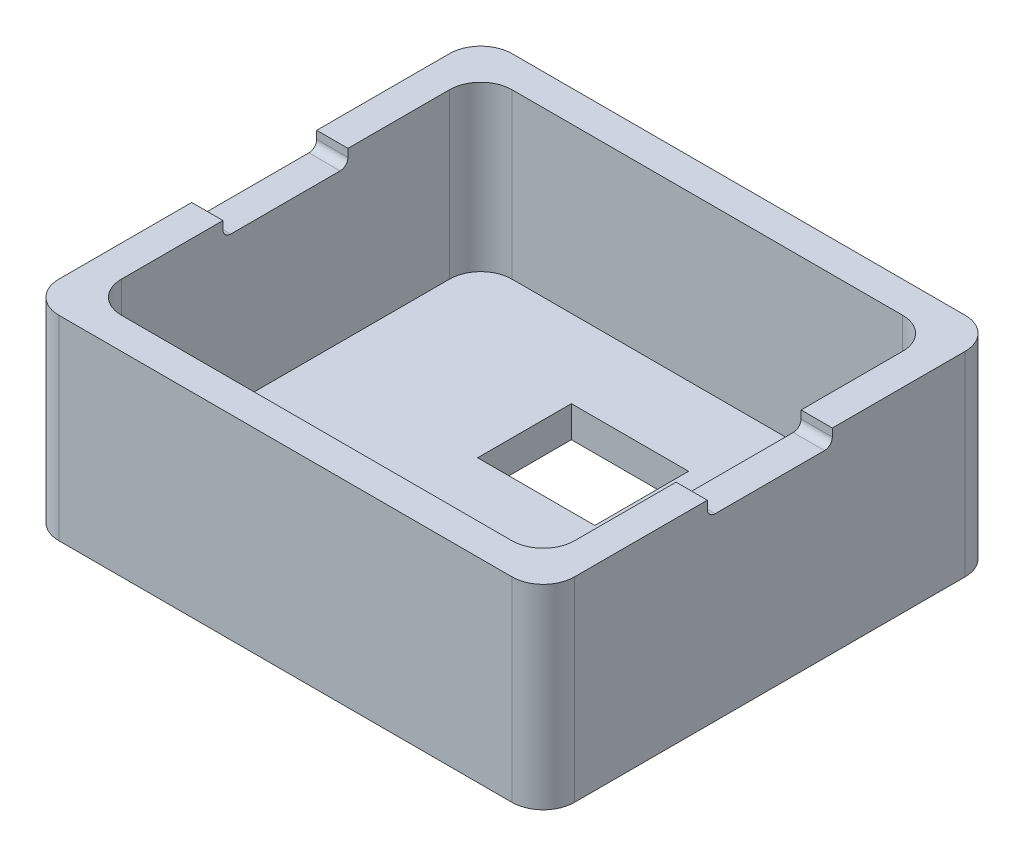
ISO-10303-21;
HEADER;
FILE_DESCRIPTION(('STEP AP214'),'2;1');
FILE_NAME('part.step','',(''),(''),'','','');
FILE_SCHEMA(('AUTOMOTIVE_DESIGN { 1 0 10303 214 1 1 1 1 }'));
ENDSEC;
DATA;
#1=APPLICATION_CONTEXT('core data for automotive mechanical design processes');
#2=APPLICATION_PROTOCOL_DEFINITION('international standard','automotive_design',2000,#1);
#3=PRODUCT_CONTEXT('',#1,'mechanical');
#4=PRODUCT('Part','Part','',(#3));
#5=PRODUCT_RELATED_PRODUCT_CATEGORY('part','',(#4));
#6=PRODUCT_DEFINITION_FORMATION('','',#4);
#7=PRODUCT_DEFINITION_CONTEXT('part definition',#1,'design');
#8=PRODUCT_DEFINITION('design','',#6,#7);
#9=PRODUCT_DEFINITION_SHAPE('','',#8);
#10=(LENGTH_UNIT() NAMED_UNIT(*) SI_UNIT(.MILLI.,.METRE.));
#11=(NAMED_UNIT(*) PLANE_ANGLE_UNIT() SI_UNIT($,.RADIAN.));
#12=(NAMED_UNIT(*) SI_UNIT($,.STERADIAN.) SOLID_ANGLE_UNIT());
#13=UNCERTAINTY_MEASURE_WITH_UNIT(LENGTH_MEASURE(1.E-05),#10,'distance_accuracy_value','');
#14=(GEOMETRIC_REPRESENTATION_CONTEXT(3) GLOBAL_UNCERTAINTY_ASSIGNED_CONTEXT((#13)) GLOBAL_UNIT_ASSIGNED_CONTEXT((#10,
#11,#12)) REPRESENTATION_CONTEXT('',''));
#15=CARTESIAN_POINT('',(0.,0.,0.));
#16=DIRECTION('',(0.,0.,1.));
#17=DIRECTION('',(1.,0.,0.));
#18=AXIS2_PLACEMENT_3D('',#15,#16,#17);
#19=CARTESIAN_POINT('',(-16.5,2.,14.5));
#20=DIRECTION('',(1.,0.,0.));
#21=DIRECTION('',(0.,0.,-1.));
#22=AXIS2_PLACEMENT_3D('',#19,#20,#21);
#23=PLANE('',#22);
#24=DIRECTION('',(0.,-1.,0.));
#25=VECTOR('',#24,1.);
#26=CARTESIAN_POINT('',(-16.5,11.5,4.));
#27=LINE('',#26,#25);
#28=CARTESIAN_POINT('',(-16.5,12.5,4.));
#29=VERTEX_POINT('',#28);
#30=CARTESIAN_POINT('',(-16.5,12.,4.));
#31=VERTEX_POINT('',#30);
#32=EDGE_CURVE('E257',#29,#31,#27,.T.);
#33=ORIENTED_EDGE('',*,*,#32,.T.);
#34=CARTESIAN_POINT('',(-16.5,12.,3.5));
#35=DIRECTION('',(1.,0.,0.));
#36=DIRECTION('',(0.,0.,-1.));
#37=AXIS2_PLACEMENT_3D('',#34,#35,#36);
#38=CIRCLE('',#37,0.5);
#39=CARTESIAN_POINT('',(-16.5,11.5,3.5));
#40=VERTEX_POINT('',#39);
#41=EDGE_CURVE('E57',#31,#40,#38,.T.);
#42=ORIENTED_EDGE('',*,*,#41,.T.);
#43=DIRECTION('',(0.,0.,-1.));
#44=VECTOR('',#43,1.);
#45=CARTESIAN_POINT('',(-16.5,11.5,4.));
#46=LINE('',#45,#44);
#47=CARTESIAN_POINT('',(-16.5,11.5,-3.5));
#48=VERTEX_POINT('',#47);
#49=EDGE_CURVE('E266',#40,#48,#46,.T.);
#50=ORIENTED_EDGE('',*,*,#49,.T.);
#51=CARTESIAN_POINT('',(-16.5,12.,-3.5));
#52=DIRECTION('',(1.,0.,0.));
#53=DIRECTION('',(0.,0.,-1.));
#54=AXIS2_PLACEMENT_3D('',#51,#52,#53);
#55=CIRCLE('',#54,0.5);
#56=CARTESIAN_POINT('',(-16.5,12.,-4.));
#57=VERTEX_POINT('',#56);
#58=EDGE_CURVE('E467',#48,#57,#55,.T.);
#59=ORIENTED_EDGE('',*,*,#58,.T.);
#60=DIRECTION('',(0.,1.,0.));
#61=VECTOR('',#60,1.);
#62=CARTESIAN_POINT('',(-16.5,11.5,-4.));
#63=LINE('',#62,#61);
#64=CARTESIAN_POINT('',(-16.5,12.5,-4.));
#65=VERTEX_POINT('',#64);
#66=EDGE_CURVE('E480',#57,#65,#63,.T.);
#67=ORIENTED_EDGE('',*,*,#66,.T.);
#68=DIRECTION('',(0.,0.,1.));
#69=VECTOR('',#68,1.);
#70=CARTESIAN_POINT('',(-16.5,12.5,14.5));
#71=LINE('',#70,#69);
#72=CARTESIAN_POINT('',(-16.5,12.5,-12.5));
#73=VERTEX_POINT('',#72);
#74=EDGE_CURVE('E282',#73,#65,#71,.T.);
#75=ORIENTED_EDGE('',*,*,#74,.F.);
#76=DIRECTION('',(0.,-1.,0.));
#77=VECTOR('',#76,1.);
#78=CARTESIAN_POINT('',(-16.5,2.,-12.5));
#79=LINE('',#78,#77);
#80=CARTESIAN_POINT('',(-16.5,0.,-12.5));
#81=VERTEX_POINT('',#80);
#82=EDGE_CURVE('E357',#73,#81,#79,.T.);
#83=ORIENTED_EDGE('',*,*,#82,.T.);
#84=DIRECTION('',(0.,0.,1.));
#85=VECTOR('',#84,1.);
#86=CARTESIAN_POINT('',(-16.5,0.,14.5));
#87=LINE('',#86,#85);
#88=CARTESIAN_POINT('',(-16.5,0.,12.5));
#89=VERTEX_POINT('',#88);
#90=EDGE_CURVE('E308',#81,#89,#87,.T.);
#91=ORIENTED_EDGE('',*,*,#90,.T.);
#92=DIRECTION('',(0.,-1.,0.));
#93=VECTOR('',#92,1.);
#94=CARTESIAN_POINT('',(-16.5,2.,12.5));
#95=LINE('',#94,#93);
#96=CARTESIAN_POINT('',(-16.5,12.5,12.5));
#97=VERTEX_POINT('',#96);
#98=EDGE_CURVE('E279',#89,#97,#95,.F.);
#99=ORIENTED_EDGE('',*,*,#98,.T.);
#100=EDGE_CURVE('E270',#29,#97,#71,.T.);
#101=ORIENTED_EDGE('',*,*,#100,.F.);
#102=EDGE_LOOP('',(#33,#42,#50,#59,#67,#75,#83,#91,#99,#101));
#103=FACE_BOUND('',#102,.T.);
#104=ADVANCED_FACE('F48',(#103),#23,.F.);
#105=CARTESIAN_POINT('',(0.,12.5,0.));
#106=DIRECTION('',(0.,-1.,0.));
#107=DIRECTION('',(0.,0.,-1.));
#108=AXIS2_PLACEMENT_3D('',#105,#106,#107);
#109=PLANE('',#108);
#110=DIRECTION('',(-1.,0.,0.));
#111=VECTOR('',#110,1.);
#112=CARTESIAN_POINT('',(22.5622577482985,12.5,4.));
#113=LINE('',#112,#111);
#114=CARTESIAN_POINT('',(-14.5,12.5,4.));
#115=VERTEX_POINT('',#114);
#116=EDGE_CURVE('E260',#115,#29,#113,.T.);
#117=ORIENTED_EDGE('',*,*,#116,.T.);
#118=ORIENTED_EDGE('',*,*,#100,.T.);
#119=CARTESIAN_POINT('',(-14.5,12.5,12.5));
#120=DIRECTION('',(0.,-1.,0.));
#121=DIRECTION('',(0.,0.,-1.));
#122=AXIS2_PLACEMENT_3D('',#119,#120,#121);
#123=CIRCLE('',#122,2.);
#124=CARTESIAN_POINT('',(-14.5,12.5,14.5));
#125=VERTEX_POINT('',#124);
#126=EDGE_CURVE('E380',#97,#125,#123,.F.);
#127=ORIENTED_EDGE('',*,*,#126,.T.);
#128=DIRECTION('',(1.,0.,0.));
#129=VECTOR('',#128,1.);
#130=CARTESIAN_POINT('',(-16.5,12.5,14.5));
#131=LINE('',#130,#129);
#132=CARTESIAN_POINT('',(14.5,12.5,14.5));
#133=VERTEX_POINT('',#132);
#134=EDGE_CURVE('E290',#125,#133,#131,.T.);
#135=ORIENTED_EDGE('',*,*,#134,.T.);
#136=CARTESIAN_POINT('',(14.5,12.5,12.5));
#137=DIRECTION('',(0.,-1.,0.));
#138=DIRECTION('',(0.,0.,-1.));
#139=AXIS2_PLACEMENT_3D('',#136,#137,#138);
#140=CIRCLE('',#139,2.);
#141=CARTESIAN_POINT('',(16.5,12.5,12.5));
#142=VERTEX_POINT('',#141);
#143=EDGE_CURVE('E383',#133,#142,#140,.F.);
#144=ORIENTED_EDGE('',*,*,#143,.T.);
#145=DIRECTION('',(0.,0.,-1.));
#146=VECTOR('',#145,1.);
#147=CARTESIAN_POINT('',(16.5,12.5,14.5));
#148=LINE('',#147,#146);
#149=CARTESIAN_POINT('',(16.5,12.5,4.));
#150=VERTEX_POINT('',#149);
#151=EDGE_CURVE('E293',#142,#150,#148,.T.);
#152=ORIENTED_EDGE('',*,*,#151,.T.);
#153=DIRECTION('',(1.,0.,0.));
#154=VECTOR('',#153,1.);
#155=CARTESIAN_POINT('',(6.43774225170145,12.5,4.));
#156=LINE('',#155,#154);
#157=CARTESIAN_POINT('',(14.5,12.5,4.));
#158=VERTEX_POINT('',#157);
#159=EDGE_CURVE('E577',#158,#150,#156,.T.);
#160=ORIENTED_EDGE('',*,*,#159,.F.);
#161=DIRECTION('',(0.,0.,-1.));
#162=VECTOR('',#161,1.);
#163=CARTESIAN_POINT('',(14.5,12.5,12.5));
#164=LINE('',#163,#162);
#165=CARTESIAN_POINT('',(14.5,12.5,10.5));
#166=VERTEX_POINT('',#165);
#167=EDGE_CURVE('E632',#166,#158,#164,.T.);
#168=ORIENTED_EDGE('',*,*,#167,.F.);
#169=CARTESIAN_POINT('',(12.5,12.5,10.5));
#170=DIRECTION('',(0.,-1.,0.));
#171=DIRECTION('',(0.,0.,-1.));
#172=AXIS2_PLACEMENT_3D('',#169,#170,#171);
#173=CIRCLE('',#172,2.);
#174=CARTESIAN_POINT('',(12.5,12.5,12.5));
#175=VERTEX_POINT('',#174);
#176=EDGE_CURVE('E413',#166,#175,#173,.T.);
#177=ORIENTED_EDGE('',*,*,#176,.T.);
#178=DIRECTION('',(1.,0.,0.));
#179=VECTOR('',#178,1.);
#180=CARTESIAN_POINT('',(-14.5,12.5,12.5));
#181=LINE('',#180,#179);
#182=CARTESIAN_POINT('',(-12.5,12.5,12.5));
#183=VERTEX_POINT('',#182);
#184=EDGE_CURVE('E644',#183,#175,#181,.T.);
#185=ORIENTED_EDGE('',*,*,#184,.F.);
#186=CARTESIAN_POINT('',(-12.5,12.5,10.5));
#187=DIRECTION('',(0.,-1.,0.));
#188=DIRECTION('',(0.,0.,-1.));
#189=AXIS2_PLACEMENT_3D('',#186,#187,#188);
#190=CIRCLE('',#189,2.);
#191=CARTESIAN_POINT('',(-14.5,12.5,10.5));
#192=VERTEX_POINT('',#191);
#193=EDGE_CURVE('E416',#183,#192,#190,.T.);
#194=ORIENTED_EDGE('',*,*,#193,.T.);
#195=DIRECTION('',(0.,0.,1.));
#196=VECTOR('',#195,1.);
#197=CARTESIAN_POINT('',(-14.5,12.5,12.5));
#198=LINE('',#197,#196);
#199=EDGE_CURVE('E273',#115,#192,#198,.T.);
#200=ORIENTED_EDGE('',*,*,#199,.F.);
#201=EDGE_LOOP('',(#117,#118,#127,#135,#144,#152,#160,#168,#177,#185,#194,#200));
#202=FACE_BOUND('',#201,.T.);
#203=ADVANCED_FACE('F269',(#202),#109,.F.);
#204=DIRECTION('',(-1.,0.,0.));
#205=VECTOR('',#204,1.);
#206=CARTESIAN_POINT('',(22.5622577482985,12.5,-4.));
#207=LINE('',#206,#205);
#208=CARTESIAN_POINT('',(-14.5,12.5,-4.));
#209=VERTEX_POINT('',#208);
#210=EDGE_CURVE('E275',#209,#65,#207,.T.);
#211=ORIENTED_EDGE('',*,*,#210,.F.);
#212=CARTESIAN_POINT('',(-14.5,12.5,-10.5));
#213=VERTEX_POINT('',#212);
#214=EDGE_CURVE('E640',#213,#209,#198,.T.);
#215=ORIENTED_EDGE('',*,*,#214,.F.);
#216=CARTESIAN_POINT('',(-12.5,12.5,-10.5));
#217=DIRECTION('',(0.,-1.,0.));
#218=DIRECTION('',(0.,0.,-1.));
#219=AXIS2_PLACEMENT_3D('',#216,#217,#218);
#220=CIRCLE('',#219,2.);
#221=CARTESIAN_POINT('',(-12.5,12.5,-12.5));
#222=VERTEX_POINT('',#221);
#223=EDGE_CURVE('E406',#213,#222,#220,.T.);
#224=ORIENTED_EDGE('',*,*,#223,.T.);
#225=DIRECTION('',(-1.,0.,0.));
#226=VECTOR('',#225,1.);
#227=CARTESIAN_POINT('',(-14.5,12.5,-12.5));
#228=LINE('',#227,#226);
#229=CARTESIAN_POINT('',(12.5,12.5,-12.5));
#230=VERTEX_POINT('',#229);
#231=EDGE_CURVE('E635',#230,#222,#228,.T.);
#232=ORIENTED_EDGE('',*,*,#231,.F.);
#233=CARTESIAN_POINT('',(12.5,12.5,-10.5));
#234=DIRECTION('',(0.,-1.,0.));
#235=DIRECTION('',(0.,0.,-1.));
#236=AXIS2_PLACEMENT_3D('',#233,#234,#235);
#237=CIRCLE('',#236,2.);
#238=CARTESIAN_POINT('',(14.5,12.5,-10.5));
#239=VERTEX_POINT('',#238);
#240=EDGE_CURVE('E409',#230,#239,#237,.T.);
#241=ORIENTED_EDGE('',*,*,#240,.T.);
#242=CARTESIAN_POINT('',(14.5,12.5,-4.));
#243=VERTEX_POINT('',#242);
#244=EDGE_CURVE('E636',#243,#239,#164,.T.);
#245=ORIENTED_EDGE('',*,*,#244,.F.);
#246=DIRECTION('',(1.,0.,0.));
#247=VECTOR('',#246,1.);
#248=CARTESIAN_POINT('',(6.43774225170145,12.5,-4.));
#249=LINE('',#248,#247);
#250=CARTESIAN_POINT('',(16.5,12.5,-4.));
#251=VERTEX_POINT('',#250);
#252=EDGE_CURVE('E574',#243,#251,#249,.T.);
#253=ORIENTED_EDGE('',*,*,#252,.T.);
#254=CARTESIAN_POINT('',(16.5,12.5,-12.5));
#255=VERTEX_POINT('',#254);
#256=EDGE_CURVE('E648',#251,#255,#148,.T.);
#257=ORIENTED_EDGE('',*,*,#256,.T.);
#258=CARTESIAN_POINT('',(14.5,12.5,-12.5));
#259=DIRECTION('',(0.,-1.,0.));
#260=DIRECTION('',(0.,0.,-1.));
#261=AXIS2_PLACEMENT_3D('',#258,#259,#260);
#262=CIRCLE('',#261,2.);
#263=CARTESIAN_POINT('',(14.5,12.5,-14.5));
#264=VERTEX_POINT('',#263);
#265=EDGE_CURVE('E386',#255,#264,#262,.F.);
#266=ORIENTED_EDGE('',*,*,#265,.T.);
#267=DIRECTION('',(-1.,0.,0.));
#268=VECTOR('',#267,1.);
#269=CARTESIAN_POINT('',(-16.5,12.5,-14.5));
#270=LINE('',#269,#268);
#271=CARTESIAN_POINT('',(-14.5,12.5,-14.5));
#272=VERTEX_POINT('',#271);
#273=EDGE_CURVE('E283',#264,#272,#270,.T.);
#274=ORIENTED_EDGE('',*,*,#273,.T.);
#275=CARTESIAN_POINT('',(-14.5,12.5,-12.5));
#276=DIRECTION('',(0.,-1.,0.));
#277=DIRECTION('',(0.,0.,-1.));
#278=AXIS2_PLACEMENT_3D('',#275,#276,#277);
#279=CIRCLE('',#278,2.);
#280=EDGE_CURVE('E389',#272,#73,#279,.F.);
#281=ORIENTED_EDGE('',*,*,#280,.T.);
#282=ORIENTED_EDGE('',*,*,#74,.T.);
#283=EDGE_LOOP('',(#211,#215,#224,#232,#241,#245,#253,#257,#266,#274,#281,#282));
#284=FACE_BOUND('',#283,.T.);
#285=ADVANCED_FACE('F492',(#284),#109,.F.);
#286=CARTESIAN_POINT('',(-14.5,12.5,12.5));
#287=DIRECTION('',(1.,0.,0.));
#288=DIRECTION('',(0.,0.,-1.));
#289=AXIS2_PLACEMENT_3D('',#286,#287,#288);
#290=PLANE('',#289);
#291=DIRECTION('',(0.,-1.,0.));
#292=VECTOR('',#291,1.);
#293=CARTESIAN_POINT('',(-14.5,12.5,-4.));
#294=LINE('',#293,#292);
#295=CARTESIAN_POINT('',(-14.5,12.,-4.));
#296=VERTEX_POINT('',#295);
#297=EDGE_CURVE('E445',#209,#296,#294,.T.);
#298=ORIENTED_EDGE('',*,*,#297,.T.);
#299=CARTESIAN_POINT('',(-14.5,12.,-3.5));
#300=DIRECTION('',(1.,0.,0.));
#301=DIRECTION('',(0.,0.,-1.));
#302=AXIS2_PLACEMENT_3D('',#299,#300,#301);
#303=CIRCLE('',#302,0.5);
#304=CARTESIAN_POINT('',(-14.5,11.5,-3.5));
#305=VERTEX_POINT('',#304);
#306=EDGE_CURVE('E470',#296,#305,#303,.F.);
#307=ORIENTED_EDGE('',*,*,#306,.T.);
#308=DIRECTION('',(0.,0.,1.));
#309=VECTOR('',#308,1.);
#310=CARTESIAN_POINT('',(-14.5,11.5,12.5));
#311=LINE('',#310,#309);
#312=CARTESIAN_POINT('',(-14.5,11.5,3.5));
#313=VERTEX_POINT('',#312);
#314=EDGE_CURVE('E449',#305,#313,#311,.T.);
#315=ORIENTED_EDGE('',*,*,#314,.T.);
#316=CARTESIAN_POINT('',(-14.5,12.,3.5));
#317=DIRECTION('',(1.,0.,0.));
#318=DIRECTION('',(0.,0.,-1.));
#319=AXIS2_PLACEMENT_3D('',#316,#317,#318);
#320=CIRCLE('',#319,0.5);
#321=CARTESIAN_POINT('',(-14.5,12.,4.));
#322=VERTEX_POINT('',#321);
#323=EDGE_CURVE('E11',#313,#322,#320,.F.);
#324=ORIENTED_EDGE('',*,*,#323,.T.);
#325=DIRECTION('',(0.,1.,0.));
#326=VECTOR('',#325,1.);
#327=CARTESIAN_POINT('',(-14.5,12.5,4.));
#328=LINE('',#327,#326);
#329=EDGE_CURVE('E452',#322,#115,#328,.T.);
#330=ORIENTED_EDGE('',*,*,#329,.T.);
#331=ORIENTED_EDGE('',*,*,#199,.T.);
#332=DIRECTION('',(0.,-1.,0.));
#333=VECTOR('',#332,1.);
#334=CARTESIAN_POINT('',(-14.5,2.,10.5));
#335=LINE('',#334,#333);
#336=CARTESIAN_POINT('',(-14.5,2.,10.5));
#337=VERTEX_POINT('',#336);
#338=EDGE_CURVE('E334',#192,#337,#335,.T.);
#339=ORIENTED_EDGE('',*,*,#338,.T.);
#340=DIRECTION('',(0.,0.,1.));
#341=VECTOR('',#340,1.);
#342=CARTESIAN_POINT('',(-14.5,2.,12.5));
#343=LINE('',#342,#341);
#344=CARTESIAN_POINT('',(-14.5,2.,-10.5));
#345=VERTEX_POINT('',#344);
#346=EDGE_CURVE('E656',#345,#337,#343,.T.);
#347=ORIENTED_EDGE('',*,*,#346,.F.);
#348=DIRECTION('',(0.,-1.,0.));
#349=VECTOR('',#348,1.);
#350=CARTESIAN_POINT('',(-14.5,12.5,-10.5));
#351=LINE('',#350,#349);
#352=EDGE_CURVE('E338',#345,#213,#351,.F.);
#353=ORIENTED_EDGE('',*,*,#352,.T.);
#354=ORIENTED_EDGE('',*,*,#214,.T.);
#355=EDGE_LOOP('',(#298,#307,#315,#324,#330,#331,#339,#347,#353,#354));
#356=FACE_BOUND('',#355,.T.);
#357=ADVANCED_FACE('F698',(#356),#290,.T.);
#358=CARTESIAN_POINT('',(0.,2.,0.));
#359=DIRECTION('',(0.,-1.,0.));
#360=DIRECTION('',(0.,0.,-1.));
#361=AXIS2_PLACEMENT_3D('',#358,#359,#360);
#362=PLANE('',#361);
#363=DIRECTION('',(-1.,0.,0.));
#364=VECTOR('',#363,1.);
#365=CARTESIAN_POINT('',(-14.5,2.,-12.5));
#366=LINE('',#365,#364);
#367=CARTESIAN_POINT('',(12.5,2.,-12.5));
#368=VERTEX_POINT('',#367);
#369=CARTESIAN_POINT('',(-12.5,2.,-12.5));
#370=VERTEX_POINT('',#369);
#371=EDGE_CURVE('E652',#368,#370,#366,.T.);
#372=ORIENTED_EDGE('',*,*,#371,.T.);
#373=CARTESIAN_POINT('',(-12.5,2.,-10.5));
#374=DIRECTION('',(0.,-1.,0.));
#375=DIRECTION('',(0.,0.,-1.));
#376=AXIS2_PLACEMENT_3D('',#373,#374,#375);
#377=CIRCLE('',#376,2.);
#378=EDGE_CURVE('E331',#370,#345,#377,.F.);
#379=ORIENTED_EDGE('',*,*,#378,.T.);
#380=ORIENTED_EDGE('',*,*,#346,.T.);
#381=CARTESIAN_POINT('',(-12.5,2.,10.5));
#382=DIRECTION('',(0.,-1.,0.));
#383=DIRECTION('',(0.,0.,-1.));
#384=AXIS2_PLACEMENT_3D('',#381,#382,#383);
#385=CIRCLE('',#384,2.);
#386=CARTESIAN_POINT('',(-12.5,2.,12.5));
#387=VERTEX_POINT('',#386);
#388=EDGE_CURVE('E322',#337,#387,#385,.F.);
#389=ORIENTED_EDGE('',*,*,#388,.T.);
#390=DIRECTION('',(1.,0.,0.));
#391=VECTOR('',#390,1.);
#392=CARTESIAN_POINT('',(-14.5,2.,12.5));
#393=LINE('',#392,#391);
#394=CARTESIAN_POINT('',(12.5,2.,12.5));
#395=VERTEX_POINT('',#394);
#396=EDGE_CURVE('E660',#387,#395,#393,.T.);
#397=ORIENTED_EDGE('',*,*,#396,.T.);
#398=CARTESIAN_POINT('',(12.5,2.,10.5));
#399=DIRECTION('',(0.,-1.,0.));
#400=DIRECTION('',(0.,0.,-1.));
#401=AXIS2_PLACEMENT_3D('',#398,#399,#400);
#402=CIRCLE('',#401,2.);
#403=CARTESIAN_POINT('',(14.5,2.,10.5));
#404=VERTEX_POINT('',#403);
#405=EDGE_CURVE('E325',#395,#404,#402,.F.);
#406=ORIENTED_EDGE('',*,*,#405,.T.);
#407=DIRECTION('',(0.,0.,-1.));
#408=VECTOR('',#407,1.);
#409=CARTESIAN_POINT('',(14.5,2.,12.5));
#410=LINE('',#409,#408);
#411=CARTESIAN_POINT('',(14.5,2.,-10.5));
#412=VERTEX_POINT('',#411);
#413=EDGE_CURVE('E631',#404,#412,#410,.T.);
#414=ORIENTED_EDGE('',*,*,#413,.T.);
#415=CARTESIAN_POINT('',(12.5,2.,-10.5));
#416=DIRECTION('',(0.,-1.,0.));
#417=DIRECTION('',(0.,0.,-1.));
#418=AXIS2_PLACEMENT_3D('',#415,#416,#417);
#419=CIRCLE('',#418,2.);
#420=EDGE_CURVE('E328',#412,#368,#419,.F.);
#421=ORIENTED_EDGE('',*,*,#420,.T.);
#422=EDGE_LOOP('',(#372,#379,#380,#389,#397,#406,#414,#421));
#423=FACE_BOUND('',#422,.T.);
#424=DIRECTION('',(0.,0.,-1.));
#425=VECTOR('',#424,1.);
#426=CARTESIAN_POINT('',(3.8,2.,-1.5));
#427=LINE('',#426,#425);
#428=CARTESIAN_POINT('',(3.8,2.,-1.5));
#429=VERTEX_POINT('',#428);
#430=CARTESIAN_POINT('',(3.8,2.,-7.5));
#431=VERTEX_POINT('',#430);
#432=EDGE_CURVE('E587',#429,#431,#427,.T.);
#433=ORIENTED_EDGE('',*,*,#432,.F.);
#434=DIRECTION('',(1.,0.,0.));
#435=VECTOR('',#434,1.);
#436=CARTESIAN_POINT('',(-3.7,2.,-1.5));
#437=LINE('',#436,#435);
#438=CARTESIAN_POINT('',(-3.7,2.,-1.5));
#439=VERTEX_POINT('',#438);
#440=EDGE_CURVE('E588',#439,#429,#437,.T.);
#441=ORIENTED_EDGE('',*,*,#440,.F.);
#442=DIRECTION('',(0.,0.,1.));
#443=VECTOR('',#442,1.);
#444=CARTESIAN_POINT('',(-3.7,2.,-1.5));
#445=LINE('',#444,#443);
#446=CARTESIAN_POINT('',(-3.7,2.,-7.5));
#447=VERTEX_POINT('',#446);
#448=EDGE_CURVE('E593',#447,#439,#445,.T.);
#449=ORIENTED_EDGE('',*,*,#448,.F.);
#450=DIRECTION('',(-1.,0.,0.));
#451=VECTOR('',#450,1.);
#452=CARTESIAN_POINT('',(-3.7,2.,-7.5));
#453=LINE('',#452,#451);
#454=EDGE_CURVE('E596',#431,#447,#453,.T.);
#455=ORIENTED_EDGE('',*,*,#454,.F.);
#456=EDGE_LOOP('',(#433,#441,#449,#455));
#457=FACE_BOUND('',#456,.T.);
#458=ADVANCED_FACE('F505',(#423,#457),#362,.F.);
#459=CARTESIAN_POINT('',(16.5,2.,14.5));
#460=DIRECTION('',(-1.,0.,0.));
#461=DIRECTION('',(0.,0.,1.));
#462=AXIS2_PLACEMENT_3D('',#459,#460,#461);
#463=PLANE('',#462);
#464=DIRECTION('',(0.,0.,-1.));
#465=VECTOR('',#464,1.);
#466=CARTESIAN_POINT('',(16.5,11.5,4.));
#467=LINE('',#466,#465);
#468=CARTESIAN_POINT('',(16.5,11.5,3.5));
#469=VERTEX_POINT('',#468);
#470=CARTESIAN_POINT('',(16.5,11.5,-3.5));
#471=VERTEX_POINT('',#470);
#472=EDGE_CURVE('E583',#469,#471,#467,.T.);
#473=ORIENTED_EDGE('',*,*,#472,.F.);
#474=CARTESIAN_POINT('',(16.5,12.,3.5));
#475=DIRECTION('',(-1.,0.,0.));
#476=DIRECTION('',(0.,0.,1.));
#477=AXIS2_PLACEMENT_3D('',#474,#475,#476);
#478=CIRCLE('',#477,0.5);
#479=CARTESIAN_POINT('',(16.5,12.,4.));
#480=VERTEX_POINT('',#479);
#481=EDGE_CURVE('E439',#469,#480,#478,.T.);
#482=ORIENTED_EDGE('',*,*,#481,.T.);
#483=DIRECTION('',(0.,-1.,0.));
#484=VECTOR('',#483,1.);
#485=CARTESIAN_POINT('',(16.5,11.5,4.));
#486=LINE('',#485,#484);
#487=EDGE_CURVE('E777',#150,#480,#486,.T.);
#488=ORIENTED_EDGE('',*,*,#487,.F.);
#489=ORIENTED_EDGE('',*,*,#151,.F.);
#490=DIRECTION('',(0.,-1.,0.));
#491=VECTOR('',#490,1.);
#492=CARTESIAN_POINT('',(16.5,2.,12.5));
#493=LINE('',#492,#491);
#494=CARTESIAN_POINT('',(16.5,0.,12.5));
#495=VERTEX_POINT('',#494);
#496=EDGE_CURVE('E392',#142,#495,#493,.T.);
#497=ORIENTED_EDGE('',*,*,#496,.T.);
#498=DIRECTION('',(0.,0.,-1.));
#499=VECTOR('',#498,1.);
#500=CARTESIAN_POINT('',(16.5,0.,14.5));
#501=LINE('',#500,#499);
#502=CARTESIAN_POINT('',(16.5,0.,-12.5));
#503=VERTEX_POINT('',#502);
#504=EDGE_CURVE('E300',#495,#503,#501,.T.);
#505=ORIENTED_EDGE('',*,*,#504,.T.);
#506=DIRECTION('',(0.,-1.,0.));
#507=VECTOR('',#506,1.);
#508=CARTESIAN_POINT('',(16.5,2.,-12.5));
#509=LINE('',#508,#507);
#510=EDGE_CURVE('E396',#503,#255,#509,.F.);
#511=ORIENTED_EDGE('',*,*,#510,.T.);
#512=ORIENTED_EDGE('',*,*,#256,.F.);
#513=DIRECTION('',(0.,1.,0.));
#514=VECTOR('',#513,1.);
#515=CARTESIAN_POINT('',(16.5,11.5,-4.));
#516=LINE('',#515,#514);
#517=CARTESIAN_POINT('',(16.5,12.,-4.));
#518=VERTEX_POINT('',#517);
#519=EDGE_CURVE('E696',#518,#251,#516,.T.);
#520=ORIENTED_EDGE('',*,*,#519,.F.);
#521=CARTESIAN_POINT('',(16.5,12.,-3.5));
#522=DIRECTION('',(-1.,0.,0.));
#523=DIRECTION('',(0.,0.,1.));
#524=AXIS2_PLACEMENT_3D('',#521,#522,#523);
#525=CIRCLE('',#524,0.5);
#526=EDGE_CURVE('E433',#518,#471,#525,.T.);
#527=ORIENTED_EDGE('',*,*,#526,.T.);
#528=EDGE_LOOP('',(#473,#482,#488,#489,#497,#505,#511,#512,#520,#527));
#529=FACE_BOUND('',#528,.T.);
#530=ADVANCED_FACE('F501',(#529),#463,.F.);
#531=CARTESIAN_POINT('',(-16.5,2.,-14.5));
#532=DIRECTION('',(0.,0.,1.));
#533=DIRECTION('',(1.,0.,0.));
#534=AXIS2_PLACEMENT_3D('',#531,#532,#533);
#535=PLANE('',#534);
#536=DIRECTION('',(-1.,0.,0.));
#537=VECTOR('',#536,1.);
#538=CARTESIAN_POINT('',(-16.5,0.,-14.5));
#539=LINE('',#538,#537);
#540=CARTESIAN_POINT('',(14.5,0.,-14.5));
#541=VERTEX_POINT('',#540);
#542=CARTESIAN_POINT('',(-14.5,0.,-14.5));
#543=VERTEX_POINT('',#542);
#544=EDGE_CURVE('E304',#541,#543,#539,.T.);
#545=ORIENTED_EDGE('',*,*,#544,.T.);
#546=DIRECTION('',(0.,-1.,0.));
#547=VECTOR('',#546,1.);
#548=CARTESIAN_POINT('',(-14.5,2.,-14.5));
#549=LINE('',#548,#547);
#550=EDGE_CURVE('E377',#543,#272,#549,.F.);
#551=ORIENTED_EDGE('',*,*,#550,.T.);
#552=ORIENTED_EDGE('',*,*,#273,.F.);
#553=DIRECTION('',(0.,-1.,0.));
#554=VECTOR('',#553,1.);
#555=CARTESIAN_POINT('',(14.5,2.,-14.5));
#556=LINE('',#555,#554);
#557=EDGE_CURVE('E373',#264,#541,#556,.T.);
#558=ORIENTED_EDGE('',*,*,#557,.T.);
#559=EDGE_LOOP('',(#545,#551,#552,#558));
#560=FACE_BOUND('',#559,.T.);
#561=ADVANCED_FACE('F498',(#560),#535,.F.);
#562=CARTESIAN_POINT('',(-16.5,2.,14.5));
#563=DIRECTION('',(0.,0.,-1.));
#564=DIRECTION('',(-1.,0.,0.));
#565=AXIS2_PLACEMENT_3D('',#562,#563,#564);
#566=PLANE('',#565);
#567=DIRECTION('',(1.,0.,0.));
#568=VECTOR('',#567,1.);
#569=CARTESIAN_POINT('',(-16.5,0.,14.5));
#570=LINE('',#569,#568);
#571=CARTESIAN_POINT('',(-14.5,0.,14.5));
#572=VERTEX_POINT('',#571);
#573=CARTESIAN_POINT('',(14.5,0.,14.5));
#574=VERTEX_POINT('',#573);
#575=EDGE_CURVE('E311',#572,#574,#570,.T.);
#576=ORIENTED_EDGE('',*,*,#575,.T.);
#577=DIRECTION('',(0.,-1.,0.));
#578=VECTOR('',#577,1.);
#579=CARTESIAN_POINT('',(14.5,2.,14.5));
#580=LINE('',#579,#578);
#581=EDGE_CURVE('E404',#574,#133,#580,.F.);
#582=ORIENTED_EDGE('',*,*,#581,.T.);
#583=ORIENTED_EDGE('',*,*,#134,.F.);
#584=DIRECTION('',(0.,-1.,0.));
#585=VECTOR('',#584,1.);
#586=CARTESIAN_POINT('',(-14.5,2.,14.5));
#587=LINE('',#586,#585);
#588=EDGE_CURVE('E400',#125,#572,#587,.T.);
#589=ORIENTED_EDGE('',*,*,#588,.T.);
#590=EDGE_LOOP('',(#576,#582,#583,#589));
#591=FACE_BOUND('',#590,.T.);
#592=ADVANCED_FACE('F496',(#591),#566,.F.);
#593=CARTESIAN_POINT('',(0.,0.,0.));
#594=DIRECTION('',(0.,-1.,0.));
#595=DIRECTION('',(0.,0.,-1.));
#596=AXIS2_PLACEMENT_3D('',#593,#594,#595);
#597=PLANE('',#596);
#598=DIRECTION('',(-1.,0.,0.));
#599=VECTOR('',#598,1.);
#600=CARTESIAN_POINT('',(-3.7,0.,-7.5));
#601=LINE('',#600,#599);
#602=CARTESIAN_POINT('',(3.8,0.,-7.5));
#603=VERTEX_POINT('',#602);
#604=CARTESIAN_POINT('',(-3.7,0.,-7.5));
#605=VERTEX_POINT('',#604);
#606=EDGE_CURVE('E592',#603,#605,#601,.T.);
#607=ORIENTED_EDGE('',*,*,#606,.T.);
#608=DIRECTION('',(0.,0.,1.));
#609=VECTOR('',#608,1.);
#610=CARTESIAN_POINT('',(-3.7,0.,-1.5));
#611=LINE('',#610,#609);
#612=CARTESIAN_POINT('',(-3.7,0.,-1.5));
#613=VERTEX_POINT('',#612);
#614=EDGE_CURVE('E618',#605,#613,#611,.T.);
#615=ORIENTED_EDGE('',*,*,#614,.T.);
#616=DIRECTION('',(1.,0.,0.));
#617=VECTOR('',#616,1.);
#618=CARTESIAN_POINT('',(-3.7,0.,-1.5));
#619=LINE('',#618,#617);
#620=CARTESIAN_POINT('',(3.8,0.,-1.5));
#621=VERTEX_POINT('',#620);
#622=EDGE_CURVE('E613',#613,#621,#619,.T.);
#623=ORIENTED_EDGE('',*,*,#622,.T.);
#624=DIRECTION('',(0.,0.,-1.));
#625=VECTOR('',#624,1.);
#626=CARTESIAN_POINT('',(3.8,0.,-1.5));
#627=LINE('',#626,#625);
#628=EDGE_CURVE('E607',#621,#603,#627,.T.);
#629=ORIENTED_EDGE('',*,*,#628,.T.);
#630=EDGE_LOOP('',(#607,#615,#623,#629));
#631=FACE_BOUND('',#630,.T.);
#632=ORIENTED_EDGE('',*,*,#90,.F.);
#633=CARTESIAN_POINT('',(-14.5,0.,-12.5));
#634=DIRECTION('',(0.,-1.,0.));
#635=DIRECTION('',(0.,0.,-1.));
#636=AXIS2_PLACEMENT_3D('',#633,#634,#635);
#637=CIRCLE('',#636,2.);
#638=EDGE_CURVE('E370',#81,#543,#637,.T.);
#639=ORIENTED_EDGE('',*,*,#638,.T.);
#640=ORIENTED_EDGE('',*,*,#544,.F.);
#641=CARTESIAN_POINT('',(14.5,0.,-12.5));
#642=DIRECTION('',(0.,-1.,0.));
#643=DIRECTION('',(0.,0.,-1.));
#644=AXIS2_PLACEMENT_3D('',#641,#642,#643);
#645=CIRCLE('',#644,2.);
#646=EDGE_CURVE('E367',#541,#503,#645,.T.);
#647=ORIENTED_EDGE('',*,*,#646,.T.);
#648=ORIENTED_EDGE('',*,*,#504,.F.);
#649=CARTESIAN_POINT('',(14.5,0.,12.5));
#650=DIRECTION('',(0.,-1.,0.));
#651=DIRECTION('',(0.,0.,-1.));
#652=AXIS2_PLACEMENT_3D('',#649,#650,#651);
#653=CIRCLE('',#652,2.);
#654=EDGE_CURVE('E364',#495,#574,#653,.T.);
#655=ORIENTED_EDGE('',*,*,#654,.T.);
#656=ORIENTED_EDGE('',*,*,#575,.F.);
#657=CARTESIAN_POINT('',(-14.5,0.,12.5));
#658=DIRECTION('',(0.,-1.,0.));
#659=DIRECTION('',(0.,0.,-1.));
#660=AXIS2_PLACEMENT_3D('',#657,#658,#659);
#661=CIRCLE('',#660,2.);
#662=EDGE_CURVE('E361',#572,#89,#661,.T.);
#663=ORIENTED_EDGE('',*,*,#662,.T.);
#664=EDGE_LOOP('',(#632,#639,#640,#647,#648,#655,#656,#663));
#665=FACE_BOUND('',#664,.T.);
#666=ADVANCED_FACE('F686',(#631,#665),#597,.T.);
#667=CARTESIAN_POINT('',(14.5,12.5,12.5));
#668=DIRECTION('',(-1.,0.,0.));
#669=DIRECTION('',(0.,0.,1.));
#670=AXIS2_PLACEMENT_3D('',#667,#668,#669);
#671=PLANE('',#670);
#672=CARTESIAN_POINT('',(14.5,12.,3.5));
#673=DIRECTION('',(-1.,0.,0.));
#674=DIRECTION('',(0.,0.,1.));
#675=AXIS2_PLACEMENT_3D('',#672,#673,#674);
#676=CIRCLE('',#675,0.5);
#677=CARTESIAN_POINT('',(14.5,12.,4.));
#678=VERTEX_POINT('',#677);
#679=CARTESIAN_POINT('',(14.5,11.5,3.5));
#680=VERTEX_POINT('',#679);
#681=EDGE_CURVE('E442',#678,#680,#676,.F.);
#682=ORIENTED_EDGE('',*,*,#681,.T.);
#683=DIRECTION('',(0.,0.,-1.));
#684=VECTOR('',#683,1.);
#685=CARTESIAN_POINT('',(14.5,11.5,4.));
#686=LINE('',#685,#684);
#687=CARTESIAN_POINT('',(14.5,11.5,-3.5));
#688=VERTEX_POINT('',#687);
#689=EDGE_CURVE('E560',#680,#688,#686,.T.);
#690=ORIENTED_EDGE('',*,*,#689,.T.);
#691=CARTESIAN_POINT('',(14.5,12.,-3.5));
#692=DIRECTION('',(-1.,0.,0.));
#693=DIRECTION('',(0.,0.,1.));
#694=AXIS2_PLACEMENT_3D('',#691,#692,#693);
#695=CIRCLE('',#694,0.5);
#696=CARTESIAN_POINT('',(14.5,12.,-4.));
#697=VERTEX_POINT('',#696);
#698=EDGE_CURVE('E436',#688,#697,#695,.F.);
#699=ORIENTED_EDGE('',*,*,#698,.T.);
#700=DIRECTION('',(0.,1.,0.));
#701=VECTOR('',#700,1.);
#702=CARTESIAN_POINT('',(14.5,11.5,-4.));
#703=LINE('',#702,#701);
#704=EDGE_CURVE('E570',#697,#243,#703,.T.);
#705=ORIENTED_EDGE('',*,*,#704,.T.);
#706=ORIENTED_EDGE('',*,*,#244,.T.);
#707=DIRECTION('',(0.,-1.,0.));
#708=VECTOR('',#707,1.);
#709=CARTESIAN_POINT('',(14.5,2.,-10.5));
#710=LINE('',#709,#708);
#711=EDGE_CURVE('E344',#239,#412,#710,.T.);
#712=ORIENTED_EDGE('',*,*,#711,.T.);
#713=ORIENTED_EDGE('',*,*,#413,.F.);
#714=DIRECTION('',(0.,-1.,0.));
#715=VECTOR('',#714,1.);
#716=CARTESIAN_POINT('',(14.5,12.5,10.5));
#717=LINE('',#716,#715);
#718=EDGE_CURVE('E341',#404,#166,#717,.F.);
#719=ORIENTED_EDGE('',*,*,#718,.T.);
#720=ORIENTED_EDGE('',*,*,#167,.T.);
#721=DIRECTION('',(0.,-1.,0.));
#722=VECTOR('',#721,1.);
#723=CARTESIAN_POINT('',(14.5,11.5,4.));
#724=LINE('',#723,#722);
#725=EDGE_CURVE('E563',#158,#678,#724,.T.);
#726=ORIENTED_EDGE('',*,*,#725,.T.);
#727=EDGE_LOOP('',(#682,#690,#699,#705,#706,#712,#713,#719,#720,#726));
#728=FACE_BOUND('',#727,.T.);
#729=ADVANCED_FACE('F559',(#728),#671,.T.);
#730=CARTESIAN_POINT('',(-14.5,12.5,-12.5));
#731=DIRECTION('',(0.,0.,1.));
#732=DIRECTION('',(1.,0.,0.));
#733=AXIS2_PLACEMENT_3D('',#730,#731,#732);
#734=PLANE('',#733);
#735=ORIENTED_EDGE('',*,*,#231,.T.);
#736=DIRECTION('',(0.,-1.,0.));
#737=VECTOR('',#736,1.);
#738=CARTESIAN_POINT('',(-12.5,2.,-12.5));
#739=LINE('',#738,#737);
#740=EDGE_CURVE('E318',#222,#370,#739,.T.);
#741=ORIENTED_EDGE('',*,*,#740,.T.);
#742=ORIENTED_EDGE('',*,*,#371,.F.);
#743=DIRECTION('',(0.,-1.,0.));
#744=VECTOR('',#743,1.);
#745=CARTESIAN_POINT('',(12.5,12.5,-12.5));
#746=LINE('',#745,#744);
#747=EDGE_CURVE('E315',#368,#230,#746,.F.);
#748=ORIENTED_EDGE('',*,*,#747,.T.);
#749=EDGE_LOOP('',(#735,#741,#742,#748));
#750=FACE_BOUND('',#749,.T.);
#751=ADVANCED_FACE('F706',(#750),#734,.T.);
#752=CARTESIAN_POINT('',(-14.5,12.5,12.5));
#753=DIRECTION('',(0.,0.,-1.));
#754=DIRECTION('',(-1.,0.,0.));
#755=AXIS2_PLACEMENT_3D('',#752,#753,#754);
#756=PLANE('',#755);
#757=ORIENTED_EDGE('',*,*,#184,.T.);
#758=DIRECTION('',(0.,-1.,0.));
#759=VECTOR('',#758,1.);
#760=CARTESIAN_POINT('',(12.5,2.,12.5));
#761=LINE('',#760,#759);
#762=EDGE_CURVE('E351',#175,#395,#761,.T.);
#763=ORIENTED_EDGE('',*,*,#762,.T.);
#764=ORIENTED_EDGE('',*,*,#396,.F.);
#765=DIRECTION('',(0.,-1.,0.));
#766=VECTOR('',#765,1.);
#767=CARTESIAN_POINT('',(-12.5,12.5,12.5));
#768=LINE('',#767,#766);
#769=EDGE_CURVE('E348',#387,#183,#768,.F.);
#770=ORIENTED_EDGE('',*,*,#769,.T.);
#771=EDGE_LOOP('',(#757,#763,#764,#770));
#772=FACE_BOUND('',#771,.T.);
#773=ADVANCED_FACE('F821',(#772),#756,.T.);
#774=CARTESIAN_POINT('',(-3.7,-9.60468635614927,-7.5));
#775=DIRECTION('',(0.,0.,-1.));
#776=DIRECTION('',(-1.,0.,0.));
#777=AXIS2_PLACEMENT_3D('',#774,#775,#776);
#778=PLANE('',#777);
#779=DIRECTION('',(0.,1.,0.));
#780=VECTOR('',#779,1.);
#781=CARTESIAN_POINT('',(3.8,-9.60468635614927,-7.5));
#782=LINE('',#781,#780);
#783=EDGE_CURVE('E611',#603,#431,#782,.T.);
#784=ORIENTED_EDGE('',*,*,#783,.T.);
#785=ORIENTED_EDGE('',*,*,#454,.T.);
#786=DIRECTION('',(0.,1.,0.));
#787=VECTOR('',#786,1.);
#788=CARTESIAN_POINT('',(-3.7,-9.60468635614927,-7.5));
#789=LINE('',#788,#787);
#790=EDGE_CURVE('E606',#605,#447,#789,.T.);
#791=ORIENTED_EDGE('',*,*,#790,.F.);
#792=ORIENTED_EDGE('',*,*,#606,.F.);
#793=EDGE_LOOP('',(#784,#785,#791,#792));
#794=FACE_BOUND('',#793,.T.);
#795=ADVANCED_FACE('F844',(#794),#778,.F.);
#796=CARTESIAN_POINT('',(-3.7,-9.60468635614927,-1.5));
#797=DIRECTION('',(-1.,0.,0.));
#798=DIRECTION('',(0.,0.,1.));
#799=AXIS2_PLACEMENT_3D('',#796,#797,#798);
#800=PLANE('',#799);
#801=ORIENTED_EDGE('',*,*,#790,.T.);
#802=ORIENTED_EDGE('',*,*,#448,.T.);
#803=DIRECTION('',(0.,1.,0.));
#804=VECTOR('',#803,1.);
#805=CARTESIAN_POINT('',(-3.7,-9.60468635614927,-1.5));
#806=LINE('',#805,#804);
#807=EDGE_CURVE('E617',#613,#439,#806,.T.);
#808=ORIENTED_EDGE('',*,*,#807,.F.);
#809=ORIENTED_EDGE('',*,*,#614,.F.);
#810=EDGE_LOOP('',(#801,#802,#808,#809));
#811=FACE_BOUND('',#810,.T.);
#812=ADVANCED_FACE('F840',(#811),#800,.F.);
#813=CARTESIAN_POINT('',(-3.7,-9.60468635614927,-1.5));
#814=DIRECTION('',(0.,0.,1.));
#815=DIRECTION('',(1.,0.,0.));
#816=AXIS2_PLACEMENT_3D('',#813,#814,#815);
#817=PLANE('',#816);
#818=ORIENTED_EDGE('',*,*,#807,.T.);
#819=ORIENTED_EDGE('',*,*,#440,.T.);
#820=DIRECTION('',(0.,1.,0.));
#821=VECTOR('',#820,1.);
#822=CARTESIAN_POINT('',(3.8,-9.60468635614927,-1.5));
#823=LINE('',#822,#821);
#824=EDGE_CURVE('E612',#621,#429,#823,.T.);
#825=ORIENTED_EDGE('',*,*,#824,.F.);
#826=ORIENTED_EDGE('',*,*,#622,.F.);
#827=EDGE_LOOP('',(#818,#819,#825,#826));
#828=FACE_BOUND('',#827,.T.);
#829=ADVANCED_FACE('F837',(#828),#817,.F.);
#830=CARTESIAN_POINT('',(3.8,-9.60468635614927,-1.5));
#831=DIRECTION('',(1.,0.,0.));
#832=DIRECTION('',(0.,0.,-1.));
#833=AXIS2_PLACEMENT_3D('',#830,#831,#832);
#834=PLANE('',#833);
#835=ORIENTED_EDGE('',*,*,#824,.T.);
#836=ORIENTED_EDGE('',*,*,#432,.T.);
#837=ORIENTED_EDGE('',*,*,#783,.F.);
#838=ORIENTED_EDGE('',*,*,#628,.F.);
#839=EDGE_LOOP('',(#835,#836,#837,#838));
#840=FACE_BOUND('',#839,.T.);
#841=ADVANCED_FACE('F511',(#840),#834,.F.);
#842=CARTESIAN_POINT('',(-12.5,12.5,-10.5));
#843=DIRECTION('',(0.,1.,0.));
#844=DIRECTION('',(0.,0.,1.));
#845=AXIS2_PLACEMENT_3D('',#842,#843,#844);
#846=CYLINDRICAL_SURFACE('',#845,2.);
#847=ORIENTED_EDGE('',*,*,#223,.F.);
#848=ORIENTED_EDGE('',*,*,#352,.F.);
#849=ORIENTED_EDGE('',*,*,#378,.F.);
#850=ORIENTED_EDGE('',*,*,#740,.F.);
#851=EDGE_LOOP('',(#847,#848,#849,#850));
#852=FACE_BOUND('',#851,.T.);
#853=ADVANCED_FACE('F507',(#852),#846,.F.);
#854=CARTESIAN_POINT('',(12.5,12.5,-10.5));
#855=DIRECTION('',(0.,1.,0.));
#856=DIRECTION('',(0.,0.,1.));
#857=AXIS2_PLACEMENT_3D('',#854,#855,#856);
#858=CYLINDRICAL_SURFACE('',#857,2.);
#859=ORIENTED_EDGE('',*,*,#240,.F.);
#860=ORIENTED_EDGE('',*,*,#747,.F.);
#861=ORIENTED_EDGE('',*,*,#420,.F.);
#862=ORIENTED_EDGE('',*,*,#711,.F.);
#863=EDGE_LOOP('',(#859,#860,#861,#862));
#864=FACE_BOUND('',#863,.T.);
#865=ADVANCED_FACE('F510',(#864),#858,.F.);
#866=CARTESIAN_POINT('',(12.5,12.5,10.5));
#867=DIRECTION('',(0.,1.,0.));
#868=DIRECTION('',(0.,0.,1.));
#869=AXIS2_PLACEMENT_3D('',#866,#867,#868);
#870=CYLINDRICAL_SURFACE('',#869,2.);
#871=ORIENTED_EDGE('',*,*,#176,.F.);
#872=ORIENTED_EDGE('',*,*,#718,.F.);
#873=ORIENTED_EDGE('',*,*,#405,.F.);
#874=ORIENTED_EDGE('',*,*,#762,.F.);
#875=EDGE_LOOP('',(#871,#872,#873,#874));
#876=FACE_BOUND('',#875,.T.);
#877=ADVANCED_FACE('F515',(#876),#870,.F.);
#878=CARTESIAN_POINT('',(-12.5,12.5,10.5));
#879=DIRECTION('',(0.,1.,0.));
#880=DIRECTION('',(0.,0.,1.));
#881=AXIS2_PLACEMENT_3D('',#878,#879,#880);
#882=CYLINDRICAL_SURFACE('',#881,2.);
#883=ORIENTED_EDGE('',*,*,#193,.F.);
#884=ORIENTED_EDGE('',*,*,#769,.F.);
#885=ORIENTED_EDGE('',*,*,#388,.F.);
#886=ORIENTED_EDGE('',*,*,#338,.F.);
#887=EDGE_LOOP('',(#883,#884,#885,#886));
#888=FACE_BOUND('',#887,.T.);
#889=ADVANCED_FACE('F519',(#888),#882,.F.);
#890=CARTESIAN_POINT('',(-14.5,2.,-12.5));
#891=DIRECTION('',(0.,-1.,0.));
#892=DIRECTION('',(0.,0.,-1.));
#893=AXIS2_PLACEMENT_3D('',#890,#891,#892);
#894=CYLINDRICAL_SURFACE('',#893,2.);
#895=ORIENTED_EDGE('',*,*,#280,.F.);
#896=ORIENTED_EDGE('',*,*,#550,.F.);
#897=ORIENTED_EDGE('',*,*,#638,.F.);
#898=ORIENTED_EDGE('',*,*,#82,.F.);
#899=EDGE_LOOP('',(#895,#896,#897,#898));
#900=FACE_BOUND('',#899,.T.);
#901=ADVANCED_FACE('F523',(#900),#894,.T.);
#902=CARTESIAN_POINT('',(14.5,2.,-12.5));
#903=DIRECTION('',(0.,-1.,0.));
#904=DIRECTION('',(0.,0.,-1.));
#905=AXIS2_PLACEMENT_3D('',#902,#903,#904);
#906=CYLINDRICAL_SURFACE('',#905,2.);
#907=ORIENTED_EDGE('',*,*,#265,.F.);
#908=ORIENTED_EDGE('',*,*,#510,.F.);
#909=ORIENTED_EDGE('',*,*,#646,.F.);
#910=ORIENTED_EDGE('',*,*,#557,.F.);
#911=EDGE_LOOP('',(#907,#908,#909,#910));
#912=FACE_BOUND('',#911,.T.);
#913=ADVANCED_FACE('F527',(#912),#906,.T.);
#914=CARTESIAN_POINT('',(14.5,2.,12.5));
#915=DIRECTION('',(0.,-1.,0.));
#916=DIRECTION('',(0.,0.,-1.));
#917=AXIS2_PLACEMENT_3D('',#914,#915,#916);
#918=CYLINDRICAL_SURFACE('',#917,2.);
#919=ORIENTED_EDGE('',*,*,#143,.F.);
#920=ORIENTED_EDGE('',*,*,#581,.F.);
#921=ORIENTED_EDGE('',*,*,#654,.F.);
#922=ORIENTED_EDGE('',*,*,#496,.F.);
#923=EDGE_LOOP('',(#919,#920,#921,#922));
#924=FACE_BOUND('',#923,.T.);
#925=ADVANCED_FACE('F531',(#924),#918,.T.);
#926=CARTESIAN_POINT('',(-14.5,2.,12.5));
#927=DIRECTION('',(0.,-1.,0.));
#928=DIRECTION('',(0.,0.,-1.));
#929=AXIS2_PLACEMENT_3D('',#926,#927,#928);
#930=CYLINDRICAL_SURFACE('',#929,2.);
#931=ORIENTED_EDGE('',*,*,#126,.F.);
#932=ORIENTED_EDGE('',*,*,#98,.F.);
#933=ORIENTED_EDGE('',*,*,#662,.F.);
#934=ORIENTED_EDGE('',*,*,#588,.F.);
#935=EDGE_LOOP('',(#931,#932,#933,#934));
#936=FACE_BOUND('',#935,.T.);
#937=ADVANCED_FACE('F535',(#936),#930,.T.);
#938=CARTESIAN_POINT('',(6.43774225170145,11.5,4.));
#939=DIRECTION('',(0.,0.,1.));
#940=DIRECTION('',(1.,0.,0.));
#941=AXIS2_PLACEMENT_3D('',#938,#939,#940);
#942=PLANE('',#941);
#943=ORIENTED_EDGE('',*,*,#487,.T.);
#944=DIRECTION('',(1.,0.,0.));
#945=VECTOR('',#944,1.);
#946=CARTESIAN_POINT('',(14.5,12.,4.));
#947=LINE('',#946,#945);
#948=EDGE_CURVE('E430',#480,#678,#947,.F.);
#949=ORIENTED_EDGE('',*,*,#948,.T.);
#950=ORIENTED_EDGE('',*,*,#725,.F.);
#951=ORIENTED_EDGE('',*,*,#159,.T.);
#952=EDGE_LOOP('',(#943,#949,#950,#951));
#953=FACE_BOUND('',#952,.T.);
#954=ADVANCED_FACE('F539',(#953),#942,.F.);
#955=CARTESIAN_POINT('',(6.43774225170145,11.5,4.));
#956=DIRECTION('',(0.,-1.,0.));
#957=DIRECTION('',(0.,0.,-1.));
#958=AXIS2_PLACEMENT_3D('',#955,#956,#957);
#959=PLANE('',#958);
#960=ORIENTED_EDGE('',*,*,#472,.T.);
#961=DIRECTION('',(1.,0.,0.));
#962=VECTOR('',#961,1.);
#963=CARTESIAN_POINT('',(14.5,11.5,-3.5));
#964=LINE('',#963,#962);
#965=EDGE_CURVE('E427',#471,#688,#964,.F.);
#966=ORIENTED_EDGE('',*,*,#965,.T.);
#967=ORIENTED_EDGE('',*,*,#689,.F.);
#968=DIRECTION('',(1.,0.,0.));
#969=VECTOR('',#968,1.);
#970=CARTESIAN_POINT('',(16.5,11.5,3.5));
#971=LINE('',#970,#969);
#972=EDGE_CURVE('E423',#680,#469,#971,.T.);
#973=ORIENTED_EDGE('',*,*,#972,.T.);
#974=EDGE_LOOP('',(#960,#966,#967,#973));
#975=FACE_BOUND('',#974,.T.);
#976=ADVANCED_FACE('F566',(#975),#959,.F.);
#977=CARTESIAN_POINT('',(6.43774225170145,11.5,-4.));
#978=DIRECTION('',(0.,0.,-1.));
#979=DIRECTION('',(-1.,0.,0.));
#980=AXIS2_PLACEMENT_3D('',#977,#978,#979);
#981=PLANE('',#980);
#982=ORIENTED_EDGE('',*,*,#704,.F.);
#983=DIRECTION('',(1.,0.,0.));
#984=VECTOR('',#983,1.);
#985=CARTESIAN_POINT('',(16.5,12.,-4.));
#986=LINE('',#985,#984);
#987=EDGE_CURVE('E419',#697,#518,#986,.T.);
#988=ORIENTED_EDGE('',*,*,#987,.T.);
#989=ORIENTED_EDGE('',*,*,#519,.T.);
#990=ORIENTED_EDGE('',*,*,#252,.F.);
#991=EDGE_LOOP('',(#982,#988,#989,#990));
#992=FACE_BOUND('',#991,.T.);
#993=ADVANCED_FACE('F545',(#992),#981,.F.);
#994=CARTESIAN_POINT('',(6.43774225170145,12.,-3.5));
#995=DIRECTION('',(-1.,0.,0.));
#996=DIRECTION('',(0.,0.,1.));
#997=AXIS2_PLACEMENT_3D('',#994,#995,#996);
#998=CYLINDRICAL_SURFACE('',#997,0.5);
#999=ORIENTED_EDGE('',*,*,#698,.F.);
#1000=ORIENTED_EDGE('',*,*,#965,.F.);
#1001=ORIENTED_EDGE('',*,*,#526,.F.);
#1002=ORIENTED_EDGE('',*,*,#987,.F.);
#1003=EDGE_LOOP('',(#999,#1000,#1001,#1002));
#1004=FACE_BOUND('',#1003,.T.);
#1005=ADVANCED_FACE('F541',(#1004),#998,.F.);
#1006=CARTESIAN_POINT('',(6.43774225170145,12.,3.5));
#1007=DIRECTION('',(-1.,0.,0.));
#1008=DIRECTION('',(0.,0.,1.));
#1009=AXIS2_PLACEMENT_3D('',#1006,#1007,#1008);
#1010=CYLINDRICAL_SURFACE('',#1009,0.5);
#1011=ORIENTED_EDGE('',*,*,#681,.F.);
#1012=ORIENTED_EDGE('',*,*,#948,.F.);
#1013=ORIENTED_EDGE('',*,*,#481,.F.);
#1014=ORIENTED_EDGE('',*,*,#972,.F.);
#1015=EDGE_LOOP('',(#1011,#1012,#1013,#1014));
#1016=FACE_BOUND('',#1015,.T.);
#1017=ADVANCED_FACE('F544',(#1016),#1010,.F.);
#1018=CARTESIAN_POINT('',(22.5622577482985,11.5,4.));
#1019=DIRECTION('',(0.,1.,0.));
#1020=DIRECTION('',(0.,0.,1.));
#1021=AXIS2_PLACEMENT_3D('',#1018,#1019,#1020);
#1022=PLANE('',#1021);
#1023=ORIENTED_EDGE('',*,*,#314,.F.);
#1024=DIRECTION('',(-1.,0.,0.));
#1025=VECTOR('',#1024,1.);
#1026=CARTESIAN_POINT('',(-16.5,11.5,-3.5));
#1027=LINE('',#1026,#1025);
#1028=EDGE_CURVE('E458',#305,#48,#1027,.T.);
#1029=ORIENTED_EDGE('',*,*,#1028,.T.);
#1030=ORIENTED_EDGE('',*,*,#49,.F.);
#1031=DIRECTION('',(-1.,0.,0.));
#1032=VECTOR('',#1031,1.);
#1033=CARTESIAN_POINT('',(-14.5,11.5,3.5));
#1034=LINE('',#1033,#1032);
#1035=EDGE_CURVE('E455',#40,#313,#1034,.F.);
#1036=ORIENTED_EDGE('',*,*,#1035,.T.);
#1037=EDGE_LOOP('',(#1023,#1029,#1030,#1036));
#1038=FACE_BOUND('',#1037,.T.);
#1039=ADVANCED_FACE('F477',(#1038),#1022,.T.);
#1040=CARTESIAN_POINT('',(22.5622577482985,11.5,4.));
#1041=DIRECTION('',(0.,0.,-1.));
#1042=DIRECTION('',(-1.,0.,0.));
#1043=AXIS2_PLACEMENT_3D('',#1040,#1041,#1042);
#1044=PLANE('',#1043);
#1045=ORIENTED_EDGE('',*,*,#329,.F.);
#1046=DIRECTION('',(-1.,0.,0.));
#1047=VECTOR('',#1046,1.);
#1048=CARTESIAN_POINT('',(-16.5,12.,4.));
#1049=LINE('',#1048,#1047);
#1050=EDGE_CURVE('E262',#322,#31,#1049,.T.);
#1051=ORIENTED_EDGE('',*,*,#1050,.T.);
#1052=ORIENTED_EDGE('',*,*,#32,.F.);
#1053=ORIENTED_EDGE('',*,*,#116,.F.);
#1054=EDGE_LOOP('',(#1045,#1051,#1052,#1053));
#1055=FACE_BOUND('',#1054,.T.);
#1056=ADVANCED_FACE('F259',(#1055),#1044,.T.);
#1057=CARTESIAN_POINT('',(22.5622577482985,11.5,-4.));
#1058=DIRECTION('',(0.,0.,1.));
#1059=DIRECTION('',(1.,0.,0.));
#1060=AXIS2_PLACEMENT_3D('',#1057,#1058,#1059);
#1061=PLANE('',#1060);
#1062=ORIENTED_EDGE('',*,*,#66,.F.);
#1063=DIRECTION('',(-1.,0.,0.));
#1064=VECTOR('',#1063,1.);
#1065=CARTESIAN_POINT('',(-14.5,12.,-4.));
#1066=LINE('',#1065,#1064);
#1067=EDGE_CURVE('E462',#57,#296,#1066,.F.);
#1068=ORIENTED_EDGE('',*,*,#1067,.T.);
#1069=ORIENTED_EDGE('',*,*,#297,.F.);
#1070=ORIENTED_EDGE('',*,*,#210,.T.);
#1071=EDGE_LOOP('',(#1062,#1068,#1069,#1070));
#1072=FACE_BOUND('',#1071,.T.);
#1073=ADVANCED_FACE('F486',(#1072),#1061,.T.);
#1074=CARTESIAN_POINT('',(22.5622577482985,12.,-3.5));
#1075=DIRECTION('',(1.,0.,0.));
#1076=DIRECTION('',(0.,0.,-1.));
#1077=AXIS2_PLACEMENT_3D('',#1074,#1075,#1076);
#1078=CYLINDRICAL_SURFACE('',#1077,0.5);
#1079=ORIENTED_EDGE('',*,*,#306,.F.);
#1080=ORIENTED_EDGE('',*,*,#1067,.F.);
#1081=ORIENTED_EDGE('',*,*,#58,.F.);
#1082=ORIENTED_EDGE('',*,*,#1028,.F.);
#1083=EDGE_LOOP('',(#1079,#1080,#1081,#1082));
#1084=FACE_BOUND('',#1083,.T.);
#1085=ADVANCED_FACE('F483',(#1084),#1078,.F.);
#1086=CARTESIAN_POINT('',(22.5622577482985,12.,3.5));
#1087=DIRECTION('',(1.,0.,0.));
#1088=DIRECTION('',(0.,0.,-1.));
#1089=AXIS2_PLACEMENT_3D('',#1086,#1087,#1088);
#1090=CYLINDRICAL_SURFACE('',#1089,0.5);
#1091=ORIENTED_EDGE('',*,*,#323,.F.);
#1092=ORIENTED_EDGE('',*,*,#1035,.F.);
#1093=ORIENTED_EDGE('',*,*,#41,.F.);
#1094=ORIENTED_EDGE('',*,*,#1050,.F.);
#1095=EDGE_LOOP('',(#1091,#1092,#1093,#1094));
#1096=FACE_BOUND('',#1095,.T.);
#1097=ADVANCED_FACE('F50',(#1096),#1090,.F.);
#1098=CLOSED_SHELL('',(#104,#203,#285,#357,#458,#530,#561,#592,#666,#729,#751,#773,#795,#812,
#829,#841,#853,#865,#877,#889,#901,#913,#925,#937,#954,#976,#993,#1005,#1017,#1039,#1056,#1073,
#1085,#1097));
#1099=MANIFOLD_SOLID_BREP('B2',#1098);
#1100=ADVANCED_BREP_SHAPE_REPRESENTATION('',(#18,#1099),#14);
#1101=SHAPE_DEFINITION_REPRESENTATION(#9,#1100);
ENDSEC;
END-ISO-10303-21;
